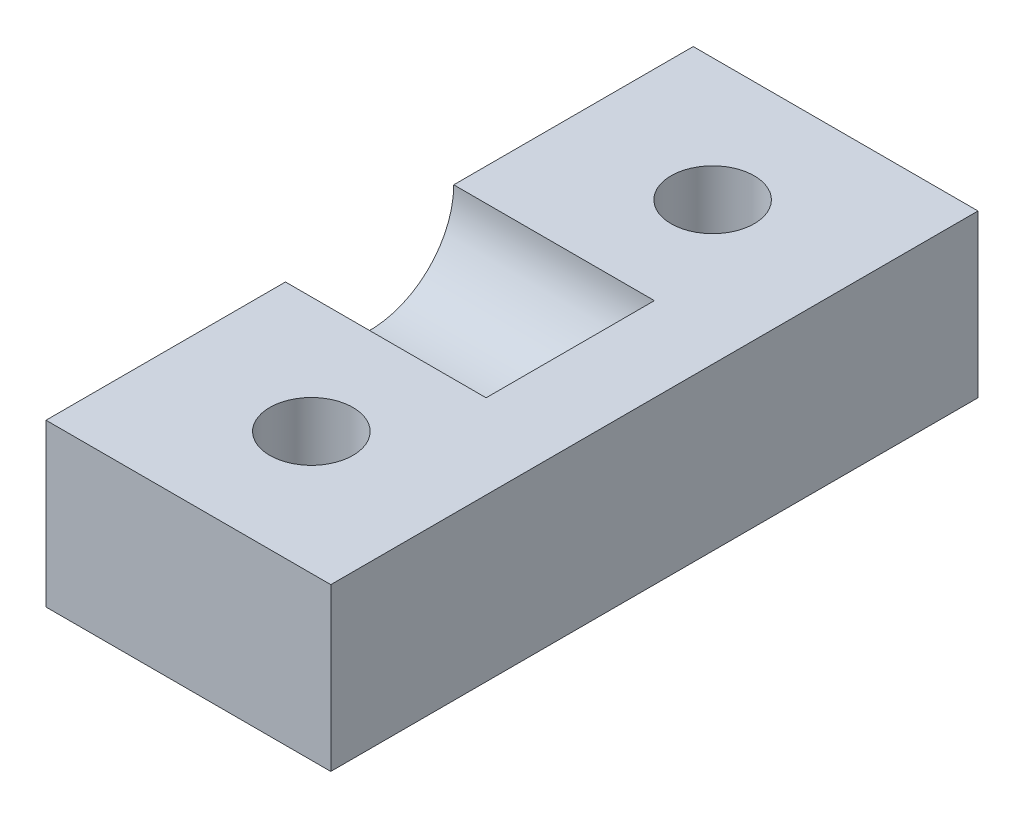
ISO-10303-21;
HEADER;
FILE_DESCRIPTION(('STEP AP214'),'2;1');
FILE_NAME('part.step','',(''),(''),'','','');
FILE_SCHEMA(('AUTOMOTIVE_DESIGN { 1 0 10303 214 1 1 1 1 }'));
ENDSEC;
DATA;
#1=APPLICATION_CONTEXT('core data for automotive mechanical design processes');
#2=APPLICATION_PROTOCOL_DEFINITION('international standard','automotive_design',2000,#1);
#3=PRODUCT_CONTEXT('',#1,'mechanical');
#4=PRODUCT('Part','Part','',(#3));
#5=PRODUCT_RELATED_PRODUCT_CATEGORY('part','',(#4));
#6=PRODUCT_DEFINITION_FORMATION('','',#4);
#7=PRODUCT_DEFINITION_CONTEXT('part definition',#1,'design');
#8=PRODUCT_DEFINITION('design','',#6,#7);
#9=PRODUCT_DEFINITION_SHAPE('','',#8);
#10=(LENGTH_UNIT() NAMED_UNIT(*) SI_UNIT(.MILLI.,.METRE.));
#11=(NAMED_UNIT(*) PLANE_ANGLE_UNIT() SI_UNIT($,.RADIAN.));
#12=(NAMED_UNIT(*) SI_UNIT($,.STERADIAN.) SOLID_ANGLE_UNIT());
#13=UNCERTAINTY_MEASURE_WITH_UNIT(LENGTH_MEASURE(1.E-05),#10,'distance_accuracy_value','');
#14=(GEOMETRIC_REPRESENTATION_CONTEXT(3) GLOBAL_UNCERTAINTY_ASSIGNED_CONTEXT((#13)) GLOBAL_UNIT_ASSIGNED_CONTEXT((#10,
#11,#12)) REPRESENTATION_CONTEXT('',''));
#15=CARTESIAN_POINT('',(0.,0.,0.));
#16=DIRECTION('',(0.,0.,1.));
#17=DIRECTION('',(1.,0.,0.));
#18=AXIS2_PLACEMENT_3D('',#15,#16,#17);
#19=CARTESIAN_POINT('',(5.588,-6.35,12.7));
#20=DIRECTION('',(1.,0.,0.));
#21=DIRECTION('',(0.,0.,-1.));
#22=AXIS2_PLACEMENT_3D('',#19,#20,#21);
#23=PLANE('',#22);
#24=DIRECTION('',(0.,0.,-1.));
#25=VECTOR('',#24,1.);
#26=CARTESIAN_POINT('',(5.588,0.,12.7));
#27=LINE('',#26,#25);
#28=CARTESIAN_POINT('',(5.588,0.,12.7));
#29=VERTEX_POINT('',#28);
#30=CARTESIAN_POINT('',(5.588,0.,-12.7));
#31=VERTEX_POINT('',#30);
#32=EDGE_CURVE('E117',#29,#31,#27,.T.);
#33=ORIENTED_EDGE('',*,*,#32,.F.);
#34=DIRECTION('',(0.,1.,0.));
#35=VECTOR('',#34,1.);
#36=CARTESIAN_POINT('',(5.588,-6.35,12.7));
#37=LINE('',#36,#35);
#38=CARTESIAN_POINT('',(5.588,-6.35,12.7));
#39=VERTEX_POINT('',#38);
#40=EDGE_CURVE('E55',#39,#29,#37,.T.);
#41=ORIENTED_EDGE('',*,*,#40,.F.);
#42=DIRECTION('',(0.,0.,-1.));
#43=VECTOR('',#42,1.);
#44=CARTESIAN_POINT('',(5.588,-6.35,12.7));
#45=LINE('',#44,#43);
#46=CARTESIAN_POINT('',(5.588,-6.35,-12.7));
#47=VERTEX_POINT('',#46);
#48=EDGE_CURVE('E122',#39,#47,#45,.T.);
#49=ORIENTED_EDGE('',*,*,#48,.T.);
#50=DIRECTION('',(0.,1.,0.));
#51=VECTOR('',#50,1.);
#52=CARTESIAN_POINT('',(5.588,-6.35,-12.7));
#53=LINE('',#52,#51);
#54=EDGE_CURVE('E81',#47,#31,#53,.T.);
#55=ORIENTED_EDGE('',*,*,#54,.T.);
#56=EDGE_LOOP('',(#33,#41,#49,#55));
#57=FACE_BOUND('',#56,.T.);
#58=ADVANCED_FACE('F33',(#57),#23,.T.);
#59=CARTESIAN_POINT('',(-5.588,-6.35,12.7));
#60=DIRECTION('',(0.,0.,1.));
#61=DIRECTION('',(1.,0.,0.));
#62=AXIS2_PLACEMENT_3D('',#59,#60,#61);
#63=PLANE('',#62);
#64=DIRECTION('',(1.,0.,0.));
#65=VECTOR('',#64,1.);
#66=CARTESIAN_POINT('',(-5.588,0.,12.7));
#67=LINE('',#66,#65);
#68=CARTESIAN_POINT('',(-5.588,0.,12.7));
#69=VERTEX_POINT('',#68);
#70=EDGE_CURVE('E115',#69,#29,#67,.T.);
#71=ORIENTED_EDGE('',*,*,#70,.F.);
#72=DIRECTION('',(0.,1.,0.));
#73=VECTOR('',#72,1.);
#74=CARTESIAN_POINT('',(-5.588,-6.35,12.7));
#75=LINE('',#74,#73);
#76=CARTESIAN_POINT('',(-5.588,-6.35,12.7));
#77=VERTEX_POINT('',#76);
#78=EDGE_CURVE('E111',#77,#69,#75,.T.);
#79=ORIENTED_EDGE('',*,*,#78,.F.);
#80=DIRECTION('',(1.,0.,0.));
#81=VECTOR('',#80,1.);
#82=CARTESIAN_POINT('',(-5.588,-6.35,12.7));
#83=LINE('',#82,#81);
#84=EDGE_CURVE('E128',#77,#39,#83,.T.);
#85=ORIENTED_EDGE('',*,*,#84,.T.);
#86=ORIENTED_EDGE('',*,*,#40,.T.);
#87=EDGE_LOOP('',(#71,#79,#85,#86));
#88=FACE_BOUND('',#87,.T.);
#89=ADVANCED_FACE('F176',(#88),#63,.T.);
#90=CARTESIAN_POINT('',(-5.588,-6.35,12.7));
#91=DIRECTION('',(-1.,0.,0.));
#92=DIRECTION('',(0.,0.,1.));
#93=AXIS2_PLACEMENT_3D('',#90,#91,#92);
#94=PLANE('',#93);
#95=CARTESIAN_POINT('',(-5.588,0.,0.));
#96=DIRECTION('',(-1.,0.,0.));
#97=DIRECTION('',(0.,0.,1.));
#98=AXIS2_PLACEMENT_3D('',#95,#96,#97);
#99=CIRCLE('',#98,3.302);
#100=CARTESIAN_POINT('',(-5.588,0.,-3.302));
#101=VERTEX_POINT('',#100);
#102=CARTESIAN_POINT('',(-5.588,0.,3.302));
#103=VERTEX_POINT('',#102);
#104=EDGE_CURVE('E93',#101,#103,#99,.T.);
#105=ORIENTED_EDGE('',*,*,#104,.F.);
#106=DIRECTION('',(0.,0.,1.));
#107=VECTOR('',#106,1.);
#108=CARTESIAN_POINT('',(-5.588,0.,12.7));
#109=LINE('',#108,#107);
#110=CARTESIAN_POINT('',(-5.588,0.,-12.7));
#111=VERTEX_POINT('',#110);
#112=EDGE_CURVE('E112',#111,#101,#109,.T.);
#113=ORIENTED_EDGE('',*,*,#112,.F.);
#114=DIRECTION('',(0.,1.,0.));
#115=VECTOR('',#114,1.);
#116=CARTESIAN_POINT('',(-5.588,-6.35,-12.7));
#117=LINE('',#116,#115);
#118=CARTESIAN_POINT('',(-5.588,-6.35,-12.7));
#119=VERTEX_POINT('',#118);
#120=EDGE_CURVE('E125',#119,#111,#117,.T.);
#121=ORIENTED_EDGE('',*,*,#120,.F.);
#122=DIRECTION('',(0.,0.,1.));
#123=VECTOR('',#122,1.);
#124=CARTESIAN_POINT('',(-5.588,-6.35,12.7));
#125=LINE('',#124,#123);
#126=EDGE_CURVE('E131',#119,#77,#125,.T.);
#127=ORIENTED_EDGE('',*,*,#126,.T.);
#128=ORIENTED_EDGE('',*,*,#78,.T.);
#129=EDGE_CURVE('E106',#103,#69,#109,.T.);
#130=ORIENTED_EDGE('',*,*,#129,.F.);
#131=EDGE_LOOP('',(#105,#113,#121,#127,#128,#130));
#132=FACE_BOUND('',#131,.T.);
#133=ADVANCED_FACE('F109',(#132),#94,.T.);
#134=CARTESIAN_POINT('',(-5.588,-6.35,-12.7));
#135=DIRECTION('',(0.,0.,-1.));
#136=DIRECTION('',(-1.,0.,0.));
#137=AXIS2_PLACEMENT_3D('',#134,#135,#136);
#138=PLANE('',#137);
#139=DIRECTION('',(-1.,0.,0.));
#140=VECTOR('',#139,1.);
#141=CARTESIAN_POINT('',(-5.588,0.,-12.7));
#142=LINE('',#141,#140);
#143=EDGE_CURVE('E113',#31,#111,#142,.T.);
#144=ORIENTED_EDGE('',*,*,#143,.F.);
#145=ORIENTED_EDGE('',*,*,#54,.F.);
#146=DIRECTION('',(-1.,0.,0.));
#147=VECTOR('',#146,1.);
#148=CARTESIAN_POINT('',(-5.588,-6.35,-12.7));
#149=LINE('',#148,#147);
#150=EDGE_CURVE('E135',#47,#119,#149,.T.);
#151=ORIENTED_EDGE('',*,*,#150,.T.);
#152=ORIENTED_EDGE('',*,*,#120,.T.);
#153=EDGE_LOOP('',(#144,#145,#151,#152));
#154=FACE_BOUND('',#153,.T.);
#155=ADVANCED_FACE('F137',(#154),#138,.T.);
#156=CARTESIAN_POINT('',(0.,-6.35,0.));
#157=DIRECTION('',(0.,-1.,0.));
#158=DIRECTION('',(0.,0.,-1.));
#159=AXIS2_PLACEMENT_3D('',#156,#157,#158);
#160=PLANE('',#159);
#161=CARTESIAN_POINT('',(0.,-6.35,7.874));
#162=DIRECTION('',(0.,-1.,0.));
#163=DIRECTION('',(0.,0.,-1.));
#164=AXIS2_PLACEMENT_3D('',#161,#162,#163);
#165=CIRCLE('',#164,1.63195);
#166=CARTESIAN_POINT('',(0.,-6.35,6.24205));
#167=VERTEX_POINT('',#166);
#168=EDGE_CURVE('E149',#167,#167,#165,.F.);
#169=ORIENTED_EDGE('',*,*,#168,.T.);
#170=EDGE_LOOP('',(#169));
#171=FACE_BOUND('',#170,.T.);
#172=CARTESIAN_POINT('',(0.,-6.35,-7.874));
#173=DIRECTION('',(0.,-1.,0.));
#174=DIRECTION('',(0.,0.,-1.));
#175=AXIS2_PLACEMENT_3D('',#172,#173,#174);
#176=CIRCLE('',#175,1.63195);
#177=CARTESIAN_POINT('',(0.,-6.35,-9.50595));
#178=VERTEX_POINT('',#177);
#179=EDGE_CURVE('E143',#178,#178,#176,.F.);
#180=ORIENTED_EDGE('',*,*,#179,.T.);
#181=EDGE_LOOP('',(#180));
#182=FACE_BOUND('',#181,.T.);
#183=ORIENTED_EDGE('',*,*,#48,.F.);
#184=ORIENTED_EDGE('',*,*,#84,.F.);
#185=ORIENTED_EDGE('',*,*,#126,.F.);
#186=ORIENTED_EDGE('',*,*,#150,.F.);
#187=EDGE_LOOP('',(#183,#184,#185,#186));
#188=FACE_BOUND('',#187,.T.);
#189=ADVANCED_FACE('F134',(#171,#182,#188),#160,.T.);
#190=CARTESIAN_POINT('',(0.,0.,0.));
#191=DIRECTION('',(0.,-1.,0.));
#192=DIRECTION('',(0.,0.,-1.));
#193=AXIS2_PLACEMENT_3D('',#190,#191,#192);
#194=PLANE('',#193);
#195=CARTESIAN_POINT('',(0.,0.,7.874));
#196=DIRECTION('',(0.,1.,0.));
#197=DIRECTION('',(0.,0.,1.));
#198=AXIS2_PLACEMENT_3D('',#195,#196,#197);
#199=CIRCLE('',#198,1.63195);
#200=CARTESIAN_POINT('',(0.,0.,9.50595));
#201=VERTEX_POINT('',#200);
#202=EDGE_CURVE('E146',#201,#201,#199,.T.);
#203=ORIENTED_EDGE('',*,*,#202,.F.);
#204=EDGE_LOOP('',(#203));
#205=FACE_BOUND('',#204,.T.);
#206=CARTESIAN_POINT('',(0.,0.,-7.874));
#207=DIRECTION('',(0.,1.,0.));
#208=DIRECTION('',(0.,0.,1.));
#209=AXIS2_PLACEMENT_3D('',#206,#207,#208);
#210=CIRCLE('',#209,1.63195);
#211=CARTESIAN_POINT('',(0.,0.,-6.24205));
#212=VERTEX_POINT('',#211);
#213=EDGE_CURVE('E101',#212,#212,#210,.T.);
#214=ORIENTED_EDGE('',*,*,#213,.F.);
#215=EDGE_LOOP('',(#214));
#216=FACE_BOUND('',#215,.T.);
#217=DIRECTION('',(0.,0.,-1.));
#218=VECTOR('',#217,1.);
#219=CARTESIAN_POINT('',(2.286,0.,0.));
#220=LINE('',#219,#218);
#221=CARTESIAN_POINT('',(2.286,0.,3.302));
#222=VERTEX_POINT('',#221);
#223=CARTESIAN_POINT('',(2.286,0.,-3.302));
#224=VERTEX_POINT('',#223);
#225=EDGE_CURVE('E108',#222,#224,#220,.T.);
#226=ORIENTED_EDGE('',*,*,#225,.F.);
#227=DIRECTION('',(-1.,0.,0.));
#228=VECTOR('',#227,1.);
#229=CARTESIAN_POINT('',(2.286,0.,3.302));
#230=LINE('',#229,#228);
#231=EDGE_CURVE('E11',#222,#103,#230,.T.);
#232=ORIENTED_EDGE('',*,*,#231,.T.);
#233=ORIENTED_EDGE('',*,*,#129,.T.);
#234=ORIENTED_EDGE('',*,*,#70,.T.);
#235=ORIENTED_EDGE('',*,*,#32,.T.);
#236=ORIENTED_EDGE('',*,*,#143,.T.);
#237=ORIENTED_EDGE('',*,*,#112,.T.);
#238=DIRECTION('',(-1.,0.,0.));
#239=VECTOR('',#238,1.);
#240=CARTESIAN_POINT('',(2.286,0.,-3.302));
#241=LINE('',#240,#239);
#242=EDGE_CURVE('E40',#101,#224,#241,.F.);
#243=ORIENTED_EDGE('',*,*,#242,.T.);
#244=EDGE_LOOP('',(#226,#232,#233,#234,#235,#236,#237,#243));
#245=FACE_BOUND('',#244,.T.);
#246=ADVANCED_FACE('F104',(#205,#216,#245),#194,.F.);
#247=CARTESIAN_POINT('',(2.286,0.,0.));
#248=DIRECTION('',(-1.,0.,0.));
#249=DIRECTION('',(0.,0.,1.));
#250=AXIS2_PLACEMENT_3D('',#247,#248,#249);
#251=CYLINDRICAL_SURFACE('',#250,3.302);
#252=CARTESIAN_POINT('',(2.286,0.,0.));
#253=DIRECTION('',(-1.,0.,0.));
#254=DIRECTION('',(0.,0.,1.));
#255=AXIS2_PLACEMENT_3D('',#252,#253,#254);
#256=CIRCLE('',#255,3.302);
#257=EDGE_CURVE('E46',#224,#222,#256,.T.);
#258=ORIENTED_EDGE('',*,*,#257,.F.);
#259=ORIENTED_EDGE('',*,*,#242,.F.);
#260=ORIENTED_EDGE('',*,*,#104,.T.);
#261=ORIENTED_EDGE('',*,*,#231,.F.);
#262=EDGE_LOOP('',(#258,#259,#260,#261));
#263=FACE_BOUND('',#262,.T.);
#264=ADVANCED_FACE('F94',(#263),#251,.F.);
#265=CARTESIAN_POINT('',(2.286,0.,0.));
#266=DIRECTION('',(-1.,0.,0.));
#267=DIRECTION('',(0.,0.,1.));
#268=AXIS2_PLACEMENT_3D('',#265,#266,#267);
#269=PLANE('',#268);
#270=ORIENTED_EDGE('',*,*,#225,.T.);
#271=ORIENTED_EDGE('',*,*,#257,.T.);
#272=EDGE_LOOP('',(#270,#271));
#273=FACE_BOUND('',#272,.T.);
#274=ADVANCED_FACE('F164',(#273),#269,.T.);
#275=CARTESIAN_POINT('',(0.,-6.351,-7.874));
#276=DIRECTION('',(0.,1.,0.));
#277=DIRECTION('',(0.,0.,1.));
#278=AXIS2_PLACEMENT_3D('',#275,#276,#277);
#279=CYLINDRICAL_SURFACE('',#278,1.63195);
#280=ORIENTED_EDGE('',*,*,#179,.F.);
#281=EDGE_LOOP('',(#280));
#282=FACE_BOUND('',#281,.T.);
#283=ORIENTED_EDGE('',*,*,#213,.T.);
#284=EDGE_LOOP('',(#283));
#285=FACE_BOUND('',#284,.T.);
#286=ADVANCED_FACE('F162',(#282,#285),#279,.F.);
#287=CARTESIAN_POINT('',(0.,-6.351,7.874));
#288=DIRECTION('',(0.,1.,0.));
#289=DIRECTION('',(0.,0.,1.));
#290=AXIS2_PLACEMENT_3D('',#287,#288,#289);
#291=CYLINDRICAL_SURFACE('',#290,1.63195);
#292=ORIENTED_EDGE('',*,*,#168,.F.);
#293=EDGE_LOOP('',(#292));
#294=FACE_BOUND('',#293,.T.);
#295=ORIENTED_EDGE('',*,*,#202,.T.);
#296=EDGE_LOOP('',(#295));
#297=FACE_BOUND('',#296,.T.);
#298=ADVANCED_FACE('F155',(#294,#297),#291,.F.);
#299=CLOSED_SHELL('',(#58,#89,#133,#155,#189,#246,#264,#274,#286,#298));
#300=MANIFOLD_SOLID_BREP('B2',#299);
#301=ADVANCED_BREP_SHAPE_REPRESENTATION('',(#18,#300),#14);
#302=SHAPE_DEFINITION_REPRESENTATION(#9,#301);
ENDSEC;
END-ISO-10303-21;
